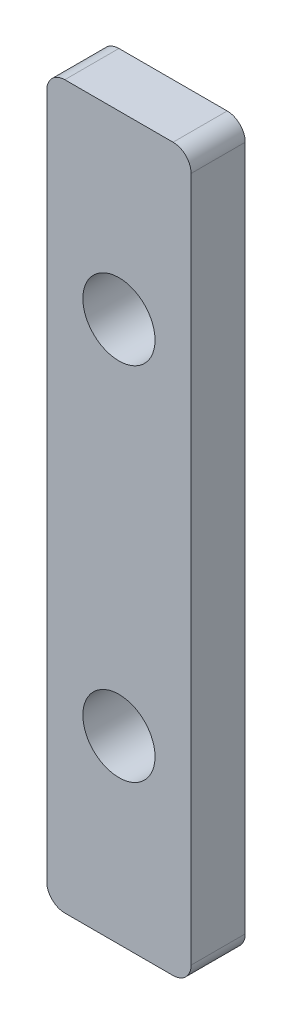
ISO-10303-21;
HEADER;
FILE_DESCRIPTION(('STEP AP214'),'2;1');
FILE_NAME('part.step','',(''),(''),'','','');
FILE_SCHEMA(('AUTOMOTIVE_DESIGN { 1 0 10303 214 1 1 1 1 }'));
ENDSEC;
DATA;
#1=APPLICATION_CONTEXT('core data for automotive mechanical design processes');
#2=APPLICATION_PROTOCOL_DEFINITION('international standard','automotive_design',2000,#1);
#3=PRODUCT_CONTEXT('',#1,'mechanical');
#4=PRODUCT('Part','Part','',(#3));
#5=PRODUCT_RELATED_PRODUCT_CATEGORY('part','',(#4));
#6=PRODUCT_DEFINITION_FORMATION('','',#4);
#7=PRODUCT_DEFINITION_CONTEXT('part definition',#1,'design');
#8=PRODUCT_DEFINITION('design','',#6,#7);
#9=PRODUCT_DEFINITION_SHAPE('','',#8);
#10=(LENGTH_UNIT() NAMED_UNIT(*) SI_UNIT(.MILLI.,.METRE.));
#11=(NAMED_UNIT(*) PLANE_ANGLE_UNIT() SI_UNIT($,.RADIAN.));
#12=(NAMED_UNIT(*) SI_UNIT($,.STERADIAN.) SOLID_ANGLE_UNIT());
#13=UNCERTAINTY_MEASURE_WITH_UNIT(LENGTH_MEASURE(1.E-05),#10,'distance_accuracy_value','');
#14=(GEOMETRIC_REPRESENTATION_CONTEXT(3) GLOBAL_UNCERTAINTY_ASSIGNED_CONTEXT((#13)) GLOBAL_UNIT_ASSIGNED_CONTEXT((#10,
#11,#12)) REPRESENTATION_CONTEXT('',''));
#15=CARTESIAN_POINT('',(0.,0.,0.));
#16=DIRECTION('',(0.,0.,1.));
#17=DIRECTION('',(1.,0.,0.));
#18=AXIS2_PLACEMENT_3D('',#15,#16,#17);
#19=CARTESIAN_POINT('',(0.,0.,3.));
#20=DIRECTION('',(0.,0.,-1.));
#21=DIRECTION('',(-1.,0.,0.));
#22=AXIS2_PLACEMENT_3D('',#19,#20,#21);
#23=PLANE('',#22);
#24=DIRECTION('',(1.,0.,0.));
#25=VECTOR('',#24,1.);
#26=CARTESIAN_POINT('',(0.,0.,3.));
#27=LINE('',#26,#25);
#28=CARTESIAN_POINT('',(1.,0.,3.));
#29=VERTEX_POINT('',#28);
#30=CARTESIAN_POINT('',(7.,0.,3.));
#31=VERTEX_POINT('',#30);
#32=EDGE_CURVE('E169',#29,#31,#27,.T.);
#33=ORIENTED_EDGE('',*,*,#32,.T.);
#34=CARTESIAN_POINT('',(7.,1.,3.));
#35=DIRECTION('',(0.,0.,-1.));
#36=DIRECTION('',(-1.,0.,0.));
#37=AXIS2_PLACEMENT_3D('',#34,#35,#36);
#38=CIRCLE('',#37,1.);
#39=CARTESIAN_POINT('',(8.,1.,3.));
#40=VERTEX_POINT('',#39);
#41=EDGE_CURVE('E147',#31,#40,#38,.F.);
#42=ORIENTED_EDGE('',*,*,#41,.T.);
#43=DIRECTION('',(0.,1.,0.));
#44=VECTOR('',#43,1.);
#45=CARTESIAN_POINT('',(8.,0.,3.));
#46=LINE('',#45,#44);
#47=CARTESIAN_POINT('',(8.,39.,3.));
#48=VERTEX_POINT('',#47);
#49=EDGE_CURVE('E117',#40,#48,#46,.T.);
#50=ORIENTED_EDGE('',*,*,#49,.T.);
#51=CARTESIAN_POINT('',(7.,39.,3.));
#52=DIRECTION('',(0.,0.,-1.));
#53=DIRECTION('',(-1.,0.,0.));
#54=AXIS2_PLACEMENT_3D('',#51,#52,#53);
#55=CIRCLE('',#54,1.);
#56=CARTESIAN_POINT('',(7.,40.,3.));
#57=VERTEX_POINT('',#56);
#58=EDGE_CURVE('E53',#48,#57,#55,.F.);
#59=ORIENTED_EDGE('',*,*,#58,.T.);
#60=DIRECTION('',(-1.,0.,0.));
#61=VECTOR('',#60,1.);
#62=CARTESIAN_POINT('',(0.,40.,3.));
#63=LINE('',#62,#61);
#64=CARTESIAN_POINT('',(1.,40.,3.));
#65=VERTEX_POINT('',#64);
#66=EDGE_CURVE('E133',#57,#65,#63,.T.);
#67=ORIENTED_EDGE('',*,*,#66,.T.);
#68=CARTESIAN_POINT('',(1.,39.,3.));
#69=DIRECTION('',(0.,0.,-1.));
#70=DIRECTION('',(-1.,0.,0.));
#71=AXIS2_PLACEMENT_3D('',#68,#69,#70);
#72=CIRCLE('',#71,1.);
#73=CARTESIAN_POINT('',(0.,39.,3.));
#74=VERTEX_POINT('',#73);
#75=EDGE_CURVE('E143',#65,#74,#72,.F.);
#76=ORIENTED_EDGE('',*,*,#75,.T.);
#77=DIRECTION('',(0.,-1.,0.));
#78=VECTOR('',#77,1.);
#79=CARTESIAN_POINT('',(0.,0.,3.));
#80=LINE('',#79,#78);
#81=CARTESIAN_POINT('',(0.,1.,3.));
#82=VERTEX_POINT('',#81);
#83=EDGE_CURVE('E127',#74,#82,#80,.T.);
#84=ORIENTED_EDGE('',*,*,#83,.T.);
#85=CARTESIAN_POINT('',(1.,1.,3.));
#86=DIRECTION('',(0.,0.,-1.));
#87=DIRECTION('',(-1.,0.,0.));
#88=AXIS2_PLACEMENT_3D('',#85,#86,#87);
#89=CIRCLE('',#88,1.);
#90=EDGE_CURVE('E145',#82,#29,#89,.F.);
#91=ORIENTED_EDGE('',*,*,#90,.T.);
#92=EDGE_LOOP('',(#33,#42,#50,#59,#67,#76,#84,#91));
#93=FACE_BOUND('',#92,.T.);
#94=CARTESIAN_POINT('',(4.,10.,3.));
#95=DIRECTION('',(0.,0.,1.));
#96=DIRECTION('',(1.,0.,0.));
#97=AXIS2_PLACEMENT_3D('',#94,#95,#96);
#98=CIRCLE('',#97,2.);
#99=CARTESIAN_POINT('',(6.,10.,3.));
#100=VERTEX_POINT('',#99);
#101=EDGE_CURVE('E178',#100,#100,#98,.T.);
#102=ORIENTED_EDGE('',*,*,#101,.F.);
#103=EDGE_LOOP('',(#102));
#104=FACE_BOUND('',#103,.T.);
#105=CARTESIAN_POINT('',(4.,30.,3.));
#106=DIRECTION('',(0.,0.,1.));
#107=DIRECTION('',(1.,0.,0.));
#108=AXIS2_PLACEMENT_3D('',#105,#106,#107);
#109=CIRCLE('',#108,2.);
#110=CARTESIAN_POINT('',(6.,30.,3.));
#111=VERTEX_POINT('',#110);
#112=EDGE_CURVE('E183',#111,#111,#109,.T.);
#113=ORIENTED_EDGE('',*,*,#112,.F.);
#114=EDGE_LOOP('',(#113));
#115=FACE_BOUND('',#114,.T.);
#116=ADVANCED_FACE('F33',(#93,#104,#115),#23,.F.);
#117=CARTESIAN_POINT('',(0.,0.,0.));
#118=DIRECTION('',(0.,0.,-1.));
#119=DIRECTION('',(-1.,0.,0.));
#120=AXIS2_PLACEMENT_3D('',#117,#118,#119);
#121=PLANE('',#120);
#122=CARTESIAN_POINT('',(4.,10.,0.));
#123=DIRECTION('',(0.,0.,1.));
#124=DIRECTION('',(1.,0.,0.));
#125=AXIS2_PLACEMENT_3D('',#122,#123,#124);
#126=CIRCLE('',#125,2.);
#127=CARTESIAN_POINT('',(6.,10.,0.));
#128=VERTEX_POINT('',#127);
#129=EDGE_CURVE('E174',#128,#128,#126,.T.);
#130=ORIENTED_EDGE('',*,*,#129,.T.);
#131=EDGE_LOOP('',(#130));
#132=FACE_BOUND('',#131,.T.);
#133=DIRECTION('',(0.,1.,0.));
#134=VECTOR('',#133,1.);
#135=CARTESIAN_POINT('',(8.,0.,0.));
#136=LINE('',#135,#134);
#137=CARTESIAN_POINT('',(8.,1.,0.));
#138=VERTEX_POINT('',#137);
#139=CARTESIAN_POINT('',(8.,39.,0.));
#140=VERTEX_POINT('',#139);
#141=EDGE_CURVE('E115',#138,#140,#136,.T.);
#142=ORIENTED_EDGE('',*,*,#141,.F.);
#143=CARTESIAN_POINT('',(7.,1.,0.));
#144=DIRECTION('',(0.,0.,-1.));
#145=DIRECTION('',(-1.,0.,0.));
#146=AXIS2_PLACEMENT_3D('',#143,#144,#145);
#147=CIRCLE('',#146,1.);
#148=CARTESIAN_POINT('',(7.,0.,0.));
#149=VERTEX_POINT('',#148);
#150=EDGE_CURVE('E98',#138,#149,#147,.T.);
#151=ORIENTED_EDGE('',*,*,#150,.T.);
#152=DIRECTION('',(1.,0.,0.));
#153=VECTOR('',#152,1.);
#154=CARTESIAN_POINT('',(0.,0.,0.));
#155=LINE('',#154,#153);
#156=CARTESIAN_POINT('',(1.,0.,0.));
#157=VERTEX_POINT('',#156);
#158=EDGE_CURVE('E125',#157,#149,#155,.T.);
#159=ORIENTED_EDGE('',*,*,#158,.F.);
#160=CARTESIAN_POINT('',(1.,1.,0.));
#161=DIRECTION('',(0.,0.,-1.));
#162=DIRECTION('',(-1.,0.,0.));
#163=AXIS2_PLACEMENT_3D('',#160,#161,#162);
#164=CIRCLE('',#163,1.);
#165=CARTESIAN_POINT('',(0.,1.,0.));
#166=VERTEX_POINT('',#165);
#167=EDGE_CURVE('E109',#157,#166,#164,.T.);
#168=ORIENTED_EDGE('',*,*,#167,.T.);
#169=DIRECTION('',(0.,-1.,0.));
#170=VECTOR('',#169,1.);
#171=CARTESIAN_POINT('',(0.,0.,0.));
#172=LINE('',#171,#170);
#173=CARTESIAN_POINT('',(0.,39.,0.));
#174=VERTEX_POINT('',#173);
#175=EDGE_CURVE('E129',#174,#166,#172,.T.);
#176=ORIENTED_EDGE('',*,*,#175,.F.);
#177=CARTESIAN_POINT('',(1.,39.,0.));
#178=DIRECTION('',(0.,0.,-1.));
#179=DIRECTION('',(-1.,0.,0.));
#180=AXIS2_PLACEMENT_3D('',#177,#178,#179);
#181=CIRCLE('',#180,1.);
#182=CARTESIAN_POINT('',(1.,40.,0.));
#183=VERTEX_POINT('',#182);
#184=EDGE_CURVE('E136',#174,#183,#181,.T.);
#185=ORIENTED_EDGE('',*,*,#184,.T.);
#186=DIRECTION('',(-1.,0.,0.));
#187=VECTOR('',#186,1.);
#188=CARTESIAN_POINT('',(0.,40.,0.));
#189=LINE('',#188,#187);
#190=CARTESIAN_POINT('',(7.,40.,0.));
#191=VERTEX_POINT('',#190);
#192=EDGE_CURVE('E124',#191,#183,#189,.T.);
#193=ORIENTED_EDGE('',*,*,#192,.F.);
#194=CARTESIAN_POINT('',(7.,39.,0.));
#195=DIRECTION('',(0.,0.,-1.));
#196=DIRECTION('',(-1.,0.,0.));
#197=AXIS2_PLACEMENT_3D('',#194,#195,#196);
#198=CIRCLE('',#197,1.);
#199=EDGE_CURVE('E118',#191,#140,#198,.T.);
#200=ORIENTED_EDGE('',*,*,#199,.T.);
#201=EDGE_LOOP('',(#142,#151,#159,#168,#176,#185,#193,#200));
#202=FACE_BOUND('',#201,.T.);
#203=CARTESIAN_POINT('',(4.,30.,0.));
#204=DIRECTION('',(0.,0.,1.));
#205=DIRECTION('',(1.,0.,0.));
#206=AXIS2_PLACEMENT_3D('',#203,#204,#205);
#207=CIRCLE('',#206,2.);
#208=CARTESIAN_POINT('',(6.,30.,0.));
#209=VERTEX_POINT('',#208);
#210=EDGE_CURVE('E185',#209,#209,#207,.T.);
#211=ORIENTED_EDGE('',*,*,#210,.T.);
#212=EDGE_LOOP('',(#211));
#213=FACE_BOUND('',#212,.T.);
#214=ADVANCED_FACE('F121',(#132,#202,#213),#121,.T.);
#215=CARTESIAN_POINT('',(0.,0.,3.));
#216=DIRECTION('',(1.,0.,0.));
#217=DIRECTION('',(0.,0.,-1.));
#218=AXIS2_PLACEMENT_3D('',#215,#216,#217);
#219=PLANE('',#218);
#220=ORIENTED_EDGE('',*,*,#175,.T.);
#221=DIRECTION('',(0.,0.,-1.));
#222=VECTOR('',#221,1.);
#223=CARTESIAN_POINT('',(0.,1.,3.));
#224=LINE('',#223,#222);
#225=EDGE_CURVE('E152',#166,#82,#224,.F.);
#226=ORIENTED_EDGE('',*,*,#225,.T.);
#227=ORIENTED_EDGE('',*,*,#83,.F.);
#228=DIRECTION('',(0.,0.,-1.));
#229=VECTOR('',#228,1.);
#230=CARTESIAN_POINT('',(0.,39.,3.));
#231=LINE('',#230,#229);
#232=EDGE_CURVE('E149',#74,#174,#231,.T.);
#233=ORIENTED_EDGE('',*,*,#232,.T.);
#234=EDGE_LOOP('',(#220,#226,#227,#233));
#235=FACE_BOUND('',#234,.T.);
#236=ADVANCED_FACE('F165',(#235),#219,.F.);
#237=CARTESIAN_POINT('',(0.,0.,3.));
#238=DIRECTION('',(0.,1.,0.));
#239=DIRECTION('',(0.,0.,1.));
#240=AXIS2_PLACEMENT_3D('',#237,#238,#239);
#241=PLANE('',#240);
#242=ORIENTED_EDGE('',*,*,#158,.T.);
#243=DIRECTION('',(0.,0.,-1.));
#244=VECTOR('',#243,1.);
#245=CARTESIAN_POINT('',(7.,0.,3.));
#246=LINE('',#245,#244);
#247=EDGE_CURVE('E103',#149,#31,#246,.F.);
#248=ORIENTED_EDGE('',*,*,#247,.T.);
#249=ORIENTED_EDGE('',*,*,#32,.F.);
#250=DIRECTION('',(0.,0.,-1.));
#251=VECTOR('',#250,1.);
#252=CARTESIAN_POINT('',(1.,0.,3.));
#253=LINE('',#252,#251);
#254=EDGE_CURVE('E108',#29,#157,#253,.T.);
#255=ORIENTED_EDGE('',*,*,#254,.T.);
#256=EDGE_LOOP('',(#242,#248,#249,#255));
#257=FACE_BOUND('',#256,.T.);
#258=ADVANCED_FACE('F210',(#257),#241,.F.);
#259=CARTESIAN_POINT('',(8.,0.,3.));
#260=DIRECTION('',(-1.,0.,0.));
#261=DIRECTION('',(0.,0.,1.));
#262=AXIS2_PLACEMENT_3D('',#259,#260,#261);
#263=PLANE('',#262);
#264=ORIENTED_EDGE('',*,*,#49,.F.);
#265=DIRECTION('',(0.,0.,-1.));
#266=VECTOR('',#265,1.);
#267=CARTESIAN_POINT('',(8.,1.,3.));
#268=LINE('',#267,#266);
#269=EDGE_CURVE('E102',#40,#138,#268,.T.);
#270=ORIENTED_EDGE('',*,*,#269,.T.);
#271=ORIENTED_EDGE('',*,*,#141,.T.);
#272=DIRECTION('',(0.,0.,-1.));
#273=VECTOR('',#272,1.);
#274=CARTESIAN_POINT('',(8.,39.,3.));
#275=LINE('',#274,#273);
#276=EDGE_CURVE('E119',#140,#48,#275,.F.);
#277=ORIENTED_EDGE('',*,*,#276,.T.);
#278=EDGE_LOOP('',(#264,#270,#271,#277));
#279=FACE_BOUND('',#278,.T.);
#280=ADVANCED_FACE('F114',(#279),#263,.F.);
#281=CARTESIAN_POINT('',(0.,40.,3.));
#282=DIRECTION('',(0.,-1.,0.));
#283=DIRECTION('',(0.,0.,-1.));
#284=AXIS2_PLACEMENT_3D('',#281,#282,#283);
#285=PLANE('',#284);
#286=ORIENTED_EDGE('',*,*,#192,.T.);
#287=DIRECTION('',(0.,0.,-1.));
#288=VECTOR('',#287,1.);
#289=CARTESIAN_POINT('',(1.,40.,3.));
#290=LINE('',#289,#288);
#291=EDGE_CURVE('E11',#183,#65,#290,.F.);
#292=ORIENTED_EDGE('',*,*,#291,.T.);
#293=ORIENTED_EDGE('',*,*,#66,.F.);
#294=DIRECTION('',(0.,0.,-1.));
#295=VECTOR('',#294,1.);
#296=CARTESIAN_POINT('',(7.,40.,3.));
#297=LINE('',#296,#295);
#298=EDGE_CURVE('E41',#57,#191,#297,.T.);
#299=ORIENTED_EDGE('',*,*,#298,.T.);
#300=EDGE_LOOP('',(#286,#292,#293,#299));
#301=FACE_BOUND('',#300,.T.);
#302=ADVANCED_FACE('F155',(#301),#285,.F.);
#303=CARTESIAN_POINT('',(4.,10.,3.));
#304=DIRECTION('',(0.,0.,-1.));
#305=DIRECTION('',(-1.,0.,0.));
#306=AXIS2_PLACEMENT_3D('',#303,#304,#305);
#307=CYLINDRICAL_SURFACE('',#306,2.);
#308=ORIENTED_EDGE('',*,*,#101,.T.);
#309=EDGE_LOOP('',(#308));
#310=FACE_BOUND('',#309,.T.);
#311=ORIENTED_EDGE('',*,*,#129,.F.);
#312=EDGE_LOOP('',(#311));
#313=FACE_BOUND('',#312,.T.);
#314=ADVANCED_FACE('F203',(#310,#313),#307,.F.);
#315=CARTESIAN_POINT('',(4.,30.,3.));
#316=DIRECTION('',(0.,0.,-1.));
#317=DIRECTION('',(-1.,0.,0.));
#318=AXIS2_PLACEMENT_3D('',#315,#316,#317);
#319=CYLINDRICAL_SURFACE('',#318,2.);
#320=ORIENTED_EDGE('',*,*,#112,.T.);
#321=EDGE_LOOP('',(#320));
#322=FACE_BOUND('',#321,.T.);
#323=ORIENTED_EDGE('',*,*,#210,.F.);
#324=EDGE_LOOP('',(#323));
#325=FACE_BOUND('',#324,.T.);
#326=ADVANCED_FACE('F191',(#322,#325),#319,.F.);
#327=CARTESIAN_POINT('',(7.,1.,3.));
#328=DIRECTION('',(0.,0.,-1.));
#329=DIRECTION('',(-1.,0.,0.));
#330=AXIS2_PLACEMENT_3D('',#327,#328,#329);
#331=CYLINDRICAL_SURFACE('',#330,1.);
#332=ORIENTED_EDGE('',*,*,#41,.F.);
#333=ORIENTED_EDGE('',*,*,#247,.F.);
#334=ORIENTED_EDGE('',*,*,#150,.F.);
#335=ORIENTED_EDGE('',*,*,#269,.F.);
#336=EDGE_LOOP('',(#332,#333,#334,#335));
#337=FACE_BOUND('',#336,.T.);
#338=ADVANCED_FACE('F101',(#337),#331,.T.);
#339=CARTESIAN_POINT('',(1.,1.,3.));
#340=DIRECTION('',(0.,0.,-1.));
#341=DIRECTION('',(-1.,0.,0.));
#342=AXIS2_PLACEMENT_3D('',#339,#340,#341);
#343=CYLINDRICAL_SURFACE('',#342,1.);
#344=ORIENTED_EDGE('',*,*,#90,.F.);
#345=ORIENTED_EDGE('',*,*,#225,.F.);
#346=ORIENTED_EDGE('',*,*,#167,.F.);
#347=ORIENTED_EDGE('',*,*,#254,.F.);
#348=EDGE_LOOP('',(#344,#345,#346,#347));
#349=FACE_BOUND('',#348,.T.);
#350=ADVANCED_FACE('F218',(#349),#343,.T.);
#351=CARTESIAN_POINT('',(1.,39.,3.));
#352=DIRECTION('',(0.,0.,-1.));
#353=DIRECTION('',(-1.,0.,0.));
#354=AXIS2_PLACEMENT_3D('',#351,#352,#353);
#355=CYLINDRICAL_SURFACE('',#354,1.);
#356=ORIENTED_EDGE('',*,*,#75,.F.);
#357=ORIENTED_EDGE('',*,*,#291,.F.);
#358=ORIENTED_EDGE('',*,*,#184,.F.);
#359=ORIENTED_EDGE('',*,*,#232,.F.);
#360=EDGE_LOOP('',(#356,#357,#358,#359));
#361=FACE_BOUND('',#360,.T.);
#362=ADVANCED_FACE('F162',(#361),#355,.T.);
#363=CARTESIAN_POINT('',(7.,39.,3.));
#364=DIRECTION('',(0.,0.,-1.));
#365=DIRECTION('',(-1.,0.,0.));
#366=AXIS2_PLACEMENT_3D('',#363,#364,#365);
#367=CYLINDRICAL_SURFACE('',#366,1.);
#368=ORIENTED_EDGE('',*,*,#58,.F.);
#369=ORIENTED_EDGE('',*,*,#276,.F.);
#370=ORIENTED_EDGE('',*,*,#199,.F.);
#371=ORIENTED_EDGE('',*,*,#298,.F.);
#372=EDGE_LOOP('',(#368,#369,#370,#371));
#373=FACE_BOUND('',#372,.T.);
#374=ADVANCED_FACE('F35',(#373),#367,.T.);
#375=CLOSED_SHELL('',(#116,#214,#236,#258,#280,#302,#314,#326,#338,#350,#362,#374));
#376=MANIFOLD_SOLID_BREP('B2',#375);
#377=ADVANCED_BREP_SHAPE_REPRESENTATION('',(#18,#376),#14);
#378=SHAPE_DEFINITION_REPRESENTATION(#9,#377);
ENDSEC;
END-ISO-10303-21;
